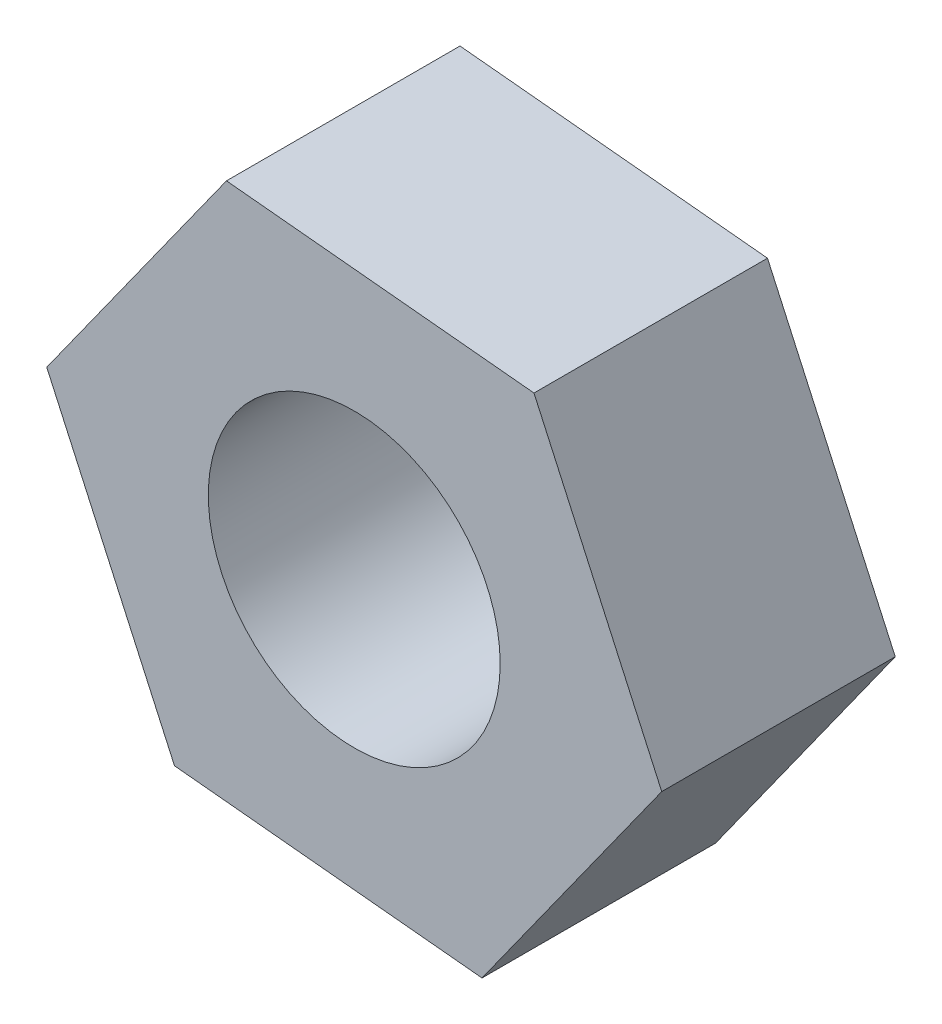
ISO-10303-21;
HEADER;
FILE_DESCRIPTION(('STEP AP214'),'2;1');
FILE_NAME('part.step','',(''),(''),'','','');
FILE_SCHEMA(('AUTOMOTIVE_DESIGN { 1 0 10303 214 1 1 1 1 }'));
ENDSEC;
DATA;
#1=APPLICATION_CONTEXT('core data for automotive mechanical design processes');
#2=APPLICATION_PROTOCOL_DEFINITION('international standard','automotive_design',2000,#1);
#3=PRODUCT_CONTEXT('',#1,'mechanical');
#4=PRODUCT('Part','Part','',(#3));
#5=PRODUCT_RELATED_PRODUCT_CATEGORY('part','',(#4));
#6=PRODUCT_DEFINITION_FORMATION('','',#4);
#7=PRODUCT_DEFINITION_CONTEXT('part definition',#1,'design');
#8=PRODUCT_DEFINITION('design','',#6,#7);
#9=PRODUCT_DEFINITION_SHAPE('','',#8);
#10=(LENGTH_UNIT() NAMED_UNIT(*) SI_UNIT(.MILLI.,.METRE.));
#11=(NAMED_UNIT(*) PLANE_ANGLE_UNIT() SI_UNIT($,.RADIAN.));
#12=(NAMED_UNIT(*) SI_UNIT($,.STERADIAN.) SOLID_ANGLE_UNIT());
#13=UNCERTAINTY_MEASURE_WITH_UNIT(LENGTH_MEASURE(1.E-05),#10,'distance_accuracy_value','');
#14=(GEOMETRIC_REPRESENTATION_CONTEXT(3) GLOBAL_UNCERTAINTY_ASSIGNED_CONTEXT((#13)) GLOBAL_UNIT_ASSIGNED_CONTEXT((#10,
#11,#12)) REPRESENTATION_CONTEXT('',''));
#15=CARTESIAN_POINT('',(0.,0.,0.));
#16=DIRECTION('',(0.,0.,1.));
#17=DIRECTION('',(1.,0.,0.));
#18=AXIS2_PLACEMENT_3D('',#15,#16,#17);
#19=CARTESIAN_POINT('',(0.,0.,2.4));
#20=DIRECTION('',(0.,0.,1.));
#21=DIRECTION('',(1.,0.,0.));
#22=AXIS2_PLACEMENT_3D('',#19,#20,#21);
#23=PLANE('',#22);
#24=DIRECTION('',(-0.413518764125319,0.910495596758309,0.));
#25=VECTOR('',#24,1.);
#26=CARTESIAN_POINT('',(3.16041210798781,-0.308429312837413,2.4));
#27=LINE('',#26,#25);
#28=CARTESIAN_POINT('',(3.16041210798781,-0.308429312837413,2.4));
#29=VERTEX_POINT('',#28);
#30=CARTESIAN_POINT('',(1.84731367418288,2.58278251552667,2.4));
#31=VERTEX_POINT('',#30);
#32=EDGE_CURVE('E128',#29,#31,#27,.T.);
#33=ORIENTED_EDGE('',*,*,#32,.T.);
#34=DIRECTION('',(-0.995271698889227,0.0971300437050828,0.));
#35=VECTOR('',#34,1.);
#36=CARTESIAN_POINT('',(1.84731367418288,2.58278251552667,2.4));
#37=LINE('',#36,#35);
#38=CARTESIAN_POINT('',(-1.31309843380493,2.89121182836408,2.4));
#39=VERTEX_POINT('',#38);
#40=EDGE_CURVE('E86',#31,#39,#37,.T.);
#41=ORIENTED_EDGE('',*,*,#40,.T.);
#42=DIRECTION('',(-0.581752934763908,-0.813365553053226,0.));
#43=VECTOR('',#42,1.);
#44=CARTESIAN_POINT('',(-1.31309843380493,2.89121182836408,2.4));
#45=LINE('',#44,#43);
#46=CARTESIAN_POINT('',(-3.16041210798781,0.308429312837412,2.4));
#47=VERTEX_POINT('',#46);
#48=EDGE_CURVE('E99',#39,#47,#45,.T.);
#49=ORIENTED_EDGE('',*,*,#48,.T.);
#50=DIRECTION('',(0.41351876412532,-0.910495596758308,0.));
#51=VECTOR('',#50,1.);
#52=CARTESIAN_POINT('',(-3.16041210798781,0.308429312837412,2.4));
#53=LINE('',#52,#51);
#54=CARTESIAN_POINT('',(-1.84731367418288,-2.58278251552667,2.4));
#55=VERTEX_POINT('',#54);
#56=EDGE_CURVE('E93',#47,#55,#53,.T.);
#57=ORIENTED_EDGE('',*,*,#56,.T.);
#58=DIRECTION('',(0.995271698889227,-0.0971300437050828,0.));
#59=VECTOR('',#58,1.);
#60=CARTESIAN_POINT('',(-1.84731367418288,-2.58278251552667,2.4));
#61=LINE('',#60,#59);
#62=CARTESIAN_POINT('',(1.31309843380493,-2.89121182836408,2.4));
#63=VERTEX_POINT('',#62);
#64=EDGE_CURVE('E97',#55,#63,#61,.T.);
#65=ORIENTED_EDGE('',*,*,#64,.T.);
#66=DIRECTION('',(0.581752934763908,0.813365553053226,0.));
#67=VECTOR('',#66,1.);
#68=CARTESIAN_POINT('',(1.31309843380493,-2.89121182836408,2.4));
#69=LINE('',#68,#67);
#70=EDGE_CURVE('E49',#63,#29,#69,.T.);
#71=ORIENTED_EDGE('',*,*,#70,.T.);
#72=EDGE_LOOP('',(#33,#41,#49,#57,#65,#71));
#73=FACE_BOUND('',#72,.T.);
#74=CARTESIAN_POINT('',(0.,0.,2.4));
#75=DIRECTION('',(0.,0.,1.));
#76=DIRECTION('',(1.,0.,0.));
#77=AXIS2_PLACEMENT_3D('',#74,#75,#76);
#78=CIRCLE('',#77,1.5);
#79=CARTESIAN_POINT('',(1.5,0.,2.4));
#80=VERTEX_POINT('',#79);
#81=EDGE_CURVE('E121',#80,#80,#78,.T.);
#82=ORIENTED_EDGE('',*,*,#81,.F.);
#83=EDGE_LOOP('',(#82));
#84=FACE_BOUND('',#83,.T.);
#85=ADVANCED_FACE('F32',(#73,#84),#23,.T.);
#86=CARTESIAN_POINT('',(0.,0.,0.));
#87=DIRECTION('',(0.,0.,1.));
#88=DIRECTION('',(1.,0.,0.));
#89=AXIS2_PLACEMENT_3D('',#86,#87,#88);
#90=PLANE('',#89);
#91=DIRECTION('',(-0.413518764125319,0.910495596758309,0.));
#92=VECTOR('',#91,1.);
#93=CARTESIAN_POINT('',(3.16041210798781,-0.308429312837413,0.));
#94=LINE('',#93,#92);
#95=CARTESIAN_POINT('',(3.16041210798781,-0.308429312837413,0.));
#96=VERTEX_POINT('',#95);
#97=CARTESIAN_POINT('',(1.84731367418288,2.58278251552667,0.));
#98=VERTEX_POINT('',#97);
#99=EDGE_CURVE('E117',#96,#98,#94,.T.);
#100=ORIENTED_EDGE('',*,*,#99,.F.);
#101=DIRECTION('',(0.581752934763908,0.813365553053226,0.));
#102=VECTOR('',#101,1.);
#103=CARTESIAN_POINT('',(1.31309843380493,-2.89121182836408,0.));
#104=LINE('',#103,#102);
#105=CARTESIAN_POINT('',(1.31309843380493,-2.89121182836408,0.));
#106=VERTEX_POINT('',#105);
#107=EDGE_CURVE('E78',#106,#96,#104,.T.);
#108=ORIENTED_EDGE('',*,*,#107,.F.);
#109=DIRECTION('',(0.995271698889227,-0.0971300437050828,0.));
#110=VECTOR('',#109,1.);
#111=CARTESIAN_POINT('',(-1.84731367418288,-2.58278251552667,0.));
#112=LINE('',#111,#110);
#113=CARTESIAN_POINT('',(-1.84731367418288,-2.58278251552667,0.));
#114=VERTEX_POINT('',#113);
#115=EDGE_CURVE('E72',#114,#106,#112,.T.);
#116=ORIENTED_EDGE('',*,*,#115,.F.);
#117=DIRECTION('',(0.41351876412532,-0.910495596758308,0.));
#118=VECTOR('',#117,1.);
#119=CARTESIAN_POINT('',(-3.16041210798781,0.308429312837412,0.));
#120=LINE('',#119,#118);
#121=CARTESIAN_POINT('',(-3.16041210798781,0.308429312837412,0.));
#122=VERTEX_POINT('',#121);
#123=EDGE_CURVE('E107',#122,#114,#120,.T.);
#124=ORIENTED_EDGE('',*,*,#123,.F.);
#125=DIRECTION('',(-0.581752934763908,-0.813365553053226,0.));
#126=VECTOR('',#125,1.);
#127=CARTESIAN_POINT('',(-1.31309843380493,2.89121182836408,0.));
#128=LINE('',#127,#126);
#129=CARTESIAN_POINT('',(-1.31309843380493,2.89121182836408,0.));
#130=VERTEX_POINT('',#129);
#131=EDGE_CURVE('E123',#130,#122,#128,.T.);
#132=ORIENTED_EDGE('',*,*,#131,.F.);
#133=DIRECTION('',(-0.995271698889227,0.0971300437050828,0.));
#134=VECTOR('',#133,1.);
#135=CARTESIAN_POINT('',(1.84731367418288,2.58278251552667,0.));
#136=LINE('',#135,#134);
#137=EDGE_CURVE('E120',#98,#130,#136,.T.);
#138=ORIENTED_EDGE('',*,*,#137,.F.);
#139=EDGE_LOOP('',(#100,#108,#116,#124,#132,#138));
#140=FACE_BOUND('',#139,.T.);
#141=CARTESIAN_POINT('',(0.,0.,0.));
#142=DIRECTION('',(0.,0.,1.));
#143=DIRECTION('',(1.,0.,0.));
#144=AXIS2_PLACEMENT_3D('',#141,#142,#143);
#145=CIRCLE('',#144,1.5);
#146=CARTESIAN_POINT('',(1.5,0.,0.));
#147=VERTEX_POINT('',#146);
#148=EDGE_CURVE('E221',#147,#147,#145,.T.);
#149=ORIENTED_EDGE('',*,*,#148,.T.);
#150=EDGE_LOOP('',(#149));
#151=FACE_BOUND('',#150,.T.);
#152=ADVANCED_FACE('F137',(#140,#151),#90,.F.);
#153=CARTESIAN_POINT('',(3.16041210798781,-0.308429312837413,2.4));
#154=DIRECTION('',(-0.910495596758309,-0.413518764125319,0.));
#155=DIRECTION('',(0.413518764125319,-0.910495596758309,0.));
#156=AXIS2_PLACEMENT_3D('',#153,#154,#155);
#157=PLANE('',#156);
#158=ORIENTED_EDGE('',*,*,#99,.T.);
#159=DIRECTION('',(0.,0.,-1.));
#160=VECTOR('',#159,1.);
#161=CARTESIAN_POINT('',(1.84731367418288,2.58278251552667,2.4));
#162=LINE('',#161,#160);
#163=EDGE_CURVE('E11',#31,#98,#162,.T.);
#164=ORIENTED_EDGE('',*,*,#163,.F.);
#165=ORIENTED_EDGE('',*,*,#32,.F.);
#166=DIRECTION('',(0.,0.,-1.));
#167=VECTOR('',#166,1.);
#168=CARTESIAN_POINT('',(3.16041210798781,-0.308429312837413,2.4));
#169=LINE('',#168,#167);
#170=EDGE_CURVE('E113',#29,#96,#169,.T.);
#171=ORIENTED_EDGE('',*,*,#170,.T.);
#172=EDGE_LOOP('',(#158,#164,#165,#171));
#173=FACE_BOUND('',#172,.T.);
#174=ADVANCED_FACE('F34',(#173),#157,.F.);
#175=CARTESIAN_POINT('',(1.84731367418288,2.58278251552667,2.4));
#176=DIRECTION('',(-0.0971300437050828,-0.995271698889227,0.));
#177=DIRECTION('',(0.995271698889227,-0.0971300437050828,0.));
#178=AXIS2_PLACEMENT_3D('',#175,#176,#177);
#179=PLANE('',#178);
#180=ORIENTED_EDGE('',*,*,#137,.T.);
#181=DIRECTION('',(0.,0.,-1.));
#182=VECTOR('',#181,1.);
#183=CARTESIAN_POINT('',(-1.31309843380493,2.89121182836408,2.4));
#184=LINE('',#183,#182);
#185=EDGE_CURVE('E41',#39,#130,#184,.T.);
#186=ORIENTED_EDGE('',*,*,#185,.F.);
#187=ORIENTED_EDGE('',*,*,#40,.F.);
#188=ORIENTED_EDGE('',*,*,#163,.T.);
#189=EDGE_LOOP('',(#180,#186,#187,#188));
#190=FACE_BOUND('',#189,.T.);
#191=ADVANCED_FACE('F162',(#190),#179,.F.);
#192=CARTESIAN_POINT('',(-1.31309843380493,2.89121182836408,2.4));
#193=DIRECTION('',(0.813365553053226,-0.581752934763908,0.));
#194=DIRECTION('',(0.581752934763908,0.813365553053226,0.));
#195=AXIS2_PLACEMENT_3D('',#192,#193,#194);
#196=PLANE('',#195);
#197=ORIENTED_EDGE('',*,*,#131,.T.);
#198=DIRECTION('',(0.,0.,-1.));
#199=VECTOR('',#198,1.);
#200=CARTESIAN_POINT('',(-3.16041210798781,0.308429312837412,2.4));
#201=LINE('',#200,#199);
#202=EDGE_CURVE('E108',#47,#122,#201,.T.);
#203=ORIENTED_EDGE('',*,*,#202,.F.);
#204=ORIENTED_EDGE('',*,*,#48,.F.);
#205=ORIENTED_EDGE('',*,*,#185,.T.);
#206=EDGE_LOOP('',(#197,#203,#204,#205));
#207=FACE_BOUND('',#206,.T.);
#208=ADVANCED_FACE('F134',(#207),#196,.F.);
#209=CARTESIAN_POINT('',(-3.16041210798781,0.308429312837412,2.4));
#210=DIRECTION('',(0.910495596758308,0.41351876412532,0.));
#211=DIRECTION('',(-0.41351876412532,0.910495596758309,0.));
#212=AXIS2_PLACEMENT_3D('',#209,#210,#211);
#213=PLANE('',#212);
#214=ORIENTED_EDGE('',*,*,#123,.T.);
#215=DIRECTION('',(0.,0.,-1.));
#216=VECTOR('',#215,1.);
#217=CARTESIAN_POINT('',(-1.84731367418288,-2.58278251552667,2.4));
#218=LINE('',#217,#216);
#219=EDGE_CURVE('E104',#55,#114,#218,.T.);
#220=ORIENTED_EDGE('',*,*,#219,.F.);
#221=ORIENTED_EDGE('',*,*,#56,.F.);
#222=ORIENTED_EDGE('',*,*,#202,.T.);
#223=EDGE_LOOP('',(#214,#220,#221,#222));
#224=FACE_BOUND('',#223,.T.);
#225=ADVANCED_FACE('F105',(#224),#213,.F.);
#226=CARTESIAN_POINT('',(-1.84731367418288,-2.58278251552667,2.4));
#227=DIRECTION('',(0.0971300437050828,0.995271698889227,0.));
#228=DIRECTION('',(-0.995271698889227,0.0971300437050828,0.));
#229=AXIS2_PLACEMENT_3D('',#226,#227,#228);
#230=PLANE('',#229);
#231=ORIENTED_EDGE('',*,*,#115,.T.);
#232=DIRECTION('',(0.,0.,-1.));
#233=VECTOR('',#232,1.);
#234=CARTESIAN_POINT('',(1.31309843380493,-2.89121182836408,2.4));
#235=LINE('',#234,#233);
#236=EDGE_CURVE('E109',#63,#106,#235,.T.);
#237=ORIENTED_EDGE('',*,*,#236,.F.);
#238=ORIENTED_EDGE('',*,*,#64,.F.);
#239=ORIENTED_EDGE('',*,*,#219,.T.);
#240=EDGE_LOOP('',(#231,#237,#238,#239));
#241=FACE_BOUND('',#240,.T.);
#242=ADVANCED_FACE('F111',(#241),#230,.F.);
#243=CARTESIAN_POINT('',(1.31309843380493,-2.89121182836408,2.4));
#244=DIRECTION('',(-0.813365553053226,0.581752934763908,0.));
#245=DIRECTION('',(-0.581752934763908,-0.813365553053226,0.));
#246=AXIS2_PLACEMENT_3D('',#243,#244,#245);
#247=PLANE('',#246);
#248=ORIENTED_EDGE('',*,*,#107,.T.);
#249=ORIENTED_EDGE('',*,*,#170,.F.);
#250=ORIENTED_EDGE('',*,*,#70,.F.);
#251=ORIENTED_EDGE('',*,*,#236,.T.);
#252=EDGE_LOOP('',(#248,#249,#250,#251));
#253=FACE_BOUND('',#252,.T.);
#254=ADVANCED_FACE('F142',(#253),#247,.F.);
#255=CARTESIAN_POINT('',(0.,0.,2.4));
#256=DIRECTION('',(0.,0.,-1.));
#257=DIRECTION('',(-1.,0.,0.));
#258=AXIS2_PLACEMENT_3D('',#255,#256,#257);
#259=CYLINDRICAL_SURFACE('',#258,1.5);
#260=ORIENTED_EDGE('',*,*,#81,.T.);
#261=EDGE_LOOP('',(#260));
#262=FACE_BOUND('',#261,.T.);
#263=ORIENTED_EDGE('',*,*,#148,.F.);
#264=EDGE_LOOP('',(#263));
#265=FACE_BOUND('',#264,.T.);
#266=ADVANCED_FACE('F144',(#262,#265),#259,.F.);
#267=CLOSED_SHELL('',(#85,#152,#174,#191,#208,#225,#242,#254,#266));
#268=MANIFOLD_SOLID_BREP('B2',#267);
#269=ADVANCED_BREP_SHAPE_REPRESENTATION('',(#18,#268),#14);
#270=SHAPE_DEFINITION_REPRESENTATION(#9,#269);
ENDSEC;
END-ISO-10303-21;
